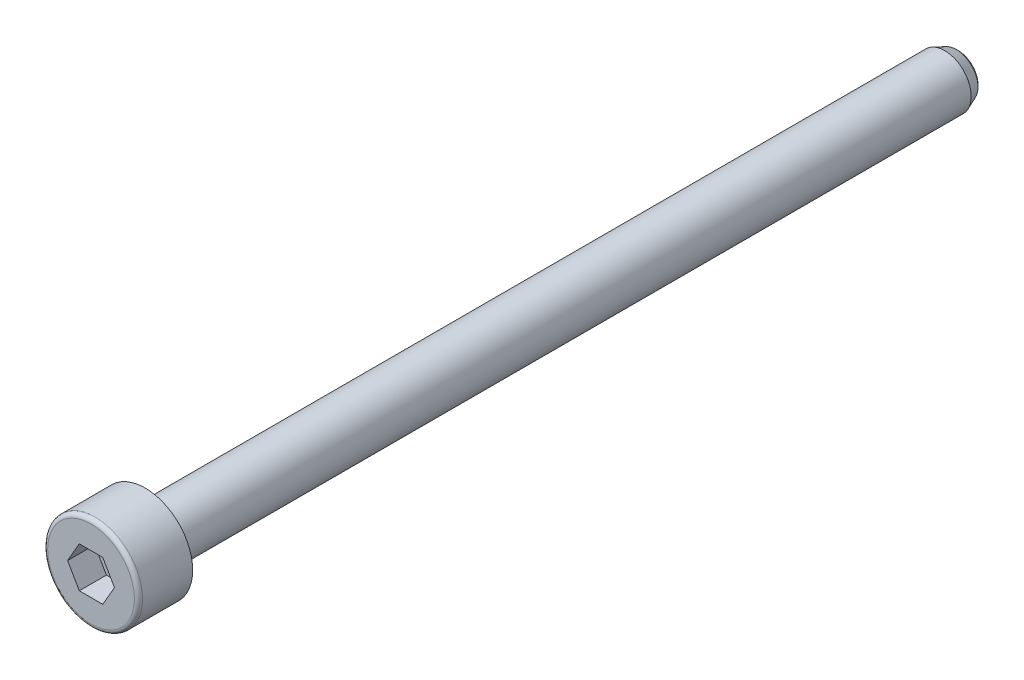
ISO-10303-21;
HEADER;
FILE_DESCRIPTION(('STEP AP214'),'2;1');
FILE_NAME('part.step','',(''),(''),'','','');
FILE_SCHEMA(('AUTOMOTIVE_DESIGN { 1 0 10303 214 1 1 1 1 }'));
ENDSEC;
DATA;
#1=APPLICATION_CONTEXT('core data for automotive mechanical design processes');
#2=APPLICATION_PROTOCOL_DEFINITION('international standard','automotive_design',2000,#1);
#3=PRODUCT_CONTEXT('',#1,'mechanical');
#4=PRODUCT('Part','Part','',(#3));
#5=PRODUCT_RELATED_PRODUCT_CATEGORY('part','',(#4));
#6=PRODUCT_DEFINITION_FORMATION('','',#4);
#7=PRODUCT_DEFINITION_CONTEXT('part definition',#1,'design');
#8=PRODUCT_DEFINITION('design','',#6,#7);
#9=PRODUCT_DEFINITION_SHAPE('','',#8);
#10=(LENGTH_UNIT() NAMED_UNIT(*) SI_UNIT(.MILLI.,.METRE.));
#11=(NAMED_UNIT(*) PLANE_ANGLE_UNIT() SI_UNIT($,.RADIAN.));
#12=(NAMED_UNIT(*) SI_UNIT($,.STERADIAN.) SOLID_ANGLE_UNIT());
#13=UNCERTAINTY_MEASURE_WITH_UNIT(LENGTH_MEASURE(1.E-05),#10,'distance_accuracy_value','');
#14=(GEOMETRIC_REPRESENTATION_CONTEXT(3) GLOBAL_UNCERTAINTY_ASSIGNED_CONTEXT((#13)) GLOBAL_UNIT_ASSIGNED_CONTEXT((#10,
#11,#12)) REPRESENTATION_CONTEXT('',''));
#15=CARTESIAN_POINT('',(0.,0.,0.));
#16=DIRECTION('',(0.,0.,1.));
#17=DIRECTION('',(1.,0.,0.));
#18=AXIS2_PLACEMENT_3D('',#15,#16,#17);
#19=CARTESIAN_POINT('',(1.06858966120171E-13,0.,-60.));
#20=DIRECTION('',(0.,0.,-1.));
#21=DIRECTION('',(0.,-1.,0.));
#22=AXIS2_PLACEMENT_3D('',#19,#20,#21);
#23=PLANE('',#22);
#24=CARTESIAN_POINT('',(1.06776702927888E-13,0.,-60.));
#25=DIRECTION('',(0.,0.,1.));
#26=DIRECTION('',(-1.,0.,0.));
#27=AXIS2_PLACEMENT_3D('',#24,#25,#26);
#28=CIRCLE('',#27,1.454);
#29=CARTESIAN_POINT('',(1.45400000000011,0.,-60.));
#30=VERTEX_POINT('',#29);
#31=EDGE_CURVE('E222',#30,#30,#28,.T.);
#32=ORIENTED_EDGE('',*,*,#31,.F.);
#33=EDGE_LOOP('',(#32));
#34=FACE_BOUND('',#33,.T.);
#35=ADVANCED_FACE('F17',(#34),#23,.T.);
#36=CARTESIAN_POINT('',(1.06581410364015E-13,0.,-5.52775046393468E-13));
#37=DIRECTION('',(0.,0.,1.));
#38=DIRECTION('',(1.,0.,0.));
#39=AXIS2_PLACEMENT_3D('',#36,#37,#38);
#40=PLANE('',#39);
#41=CARTESIAN_POINT('',(1.06776702927888E-13,0.,-5.52682288756586E-13));
#42=DIRECTION('',(0.,0.,-1.));
#43=DIRECTION('',(-1.,0.,0.));
#44=AXIS2_PLACEMENT_3D('',#41,#42,#43);
#45=CIRCLE('',#44,1.954);
#46=CARTESIAN_POINT('',(1.95400000000011,0.,-5.52682288756586E-13));
#47=VERTEX_POINT('',#46);
#48=EDGE_CURVE('E196',#47,#47,#45,.T.);
#49=ORIENTED_EDGE('',*,*,#48,.F.);
#50=EDGE_LOOP('',(#49));
#51=FACE_BOUND('',#50,.T.);
#52=CARTESIAN_POINT('',(1.06776702927888E-13,0.,-5.52775046393468E-13));
#53=DIRECTION('',(0.,0.,1.));
#54=DIRECTION('',(-1.,0.,0.));
#55=AXIS2_PLACEMENT_3D('',#52,#53,#54);
#56=CIRCLE('',#55,3.5);
#57=CARTESIAN_POINT('',(3.50000000000011,0.,-5.52775046393468E-13));
#58=VERTEX_POINT('',#57);
#59=EDGE_CURVE('E125',#58,#58,#56,.T.);
#60=ORIENTED_EDGE('',*,*,#59,.F.);
#61=EDGE_LOOP('',(#60));
#62=FACE_BOUND('',#61,.T.);
#63=ADVANCED_FACE('F284',(#51,#62),#40,.F.);
#64=CARTESIAN_POINT('',(0.,0.,1.99999999999945));
#65=DIRECTION('',(0.,0.,-1.));
#66=DIRECTION('',(0.,-1.,0.));
#67=AXIS2_PLACEMENT_3D('',#64,#65,#66);
#68=PLANE('',#67);
#69=DIRECTION('',(1.,0.,0.));
#70=VECTOR('',#69,1.);
#71=CARTESIAN_POINT('',(0.866025403784441,1.5,1.99999999999945));
#72=LINE('',#71,#70);
#73=CARTESIAN_POINT('',(-0.866025403784439,1.5,1.99999999999945));
#74=VERTEX_POINT('',#73);
#75=CARTESIAN_POINT('',(0.866025403784441,1.5,1.99999999999945));
#76=VERTEX_POINT('',#75);
#77=EDGE_CURVE('E11',#74,#76,#72,.T.);
#78=ORIENTED_EDGE('',*,*,#77,.F.);
#79=DIRECTION('',(0.5,0.866025403784439,0.));
#80=VECTOR('',#79,1.);
#81=CARTESIAN_POINT('',(-0.866025403784439,1.5,1.99999999999945));
#82=LINE('',#81,#80);
#83=CARTESIAN_POINT('',(-1.73205080756888,0.,1.99999999999945));
#84=VERTEX_POINT('',#83);
#85=EDGE_CURVE('E163',#84,#74,#82,.T.);
#86=ORIENTED_EDGE('',*,*,#85,.F.);
#87=DIRECTION('',(-0.5,0.866025403784439,0.));
#88=VECTOR('',#87,1.);
#89=CARTESIAN_POINT('',(-1.73205080756888,0.,1.99999999999945));
#90=LINE('',#89,#88);
#91=CARTESIAN_POINT('',(-0.86602540378444,-1.5,1.99999999999945));
#92=VERTEX_POINT('',#91);
#93=EDGE_CURVE('E171',#92,#84,#90,.T.);
#94=ORIENTED_EDGE('',*,*,#93,.F.);
#95=DIRECTION('',(-1.,0.,0.));
#96=VECTOR('',#95,1.);
#97=CARTESIAN_POINT('',(-0.86602540378444,-1.5,1.99999999999945));
#98=LINE('',#97,#96);
#99=CARTESIAN_POINT('',(0.866025403784436,-1.5,1.99999999999945));
#100=VERTEX_POINT('',#99);
#101=EDGE_CURVE('E176',#100,#92,#98,.T.);
#102=ORIENTED_EDGE('',*,*,#101,.F.);
#103=DIRECTION('',(-0.5,-0.866025403784438,0.));
#104=VECTOR('',#103,1.);
#105=CARTESIAN_POINT('',(0.866025403784436,-1.5,1.99999999999945));
#106=LINE('',#105,#104);
#107=CARTESIAN_POINT('',(1.73205080756888,0.,1.99999999999945));
#108=VERTEX_POINT('',#107);
#109=EDGE_CURVE('E183',#108,#100,#106,.T.);
#110=ORIENTED_EDGE('',*,*,#109,.F.);
#111=DIRECTION('',(0.5,-0.866025403784439,0.));
#112=VECTOR('',#111,1.);
#113=CARTESIAN_POINT('',(1.73205080756888,0.,1.99999999999945));
#114=LINE('',#113,#112);
#115=EDGE_CURVE('E26',#76,#108,#114,.T.);
#116=ORIENTED_EDGE('',*,*,#115,.F.);
#117=EDGE_LOOP('',(#78,#86,#94,#102,#110,#116));
#118=FACE_BOUND('',#117,.T.);
#119=ADVANCED_FACE('F19',(#118),#68,.F.);
#120=CARTESIAN_POINT('',(-0.866025403784439,1.5,3.99999999999945));
#121=DIRECTION('',(0.,1.,0.));
#122=DIRECTION('',(1.,0.,0.));
#123=AXIS2_PLACEMENT_3D('',#120,#121,#122);
#124=PLANE('',#123);
#125=DIRECTION('',(1.,0.,0.));
#126=VECTOR('',#125,1.);
#127=CARTESIAN_POINT('',(-0.433012701892165,1.5,3.99999999999945));
#128=LINE('',#127,#126);
#129=CARTESIAN_POINT('',(-0.866025403784439,1.5,3.99999999999945));
#130=VERTEX_POINT('',#129);
#131=CARTESIAN_POINT('',(0.866025403784441,1.5,3.99999999999945));
#132=VERTEX_POINT('',#131);
#133=EDGE_CURVE('E144',#130,#132,#128,.T.);
#134=ORIENTED_EDGE('',*,*,#133,.F.);
#135=DIRECTION('',(0.,0.,-1.));
#136=VECTOR('',#135,1.);
#137=CARTESIAN_POINT('',(-0.866025403784439,1.5,3.99999999999945));
#138=LINE('',#137,#136);
#139=EDGE_CURVE('E164',#130,#74,#138,.T.);
#140=ORIENTED_EDGE('',*,*,#139,.T.);
#141=ORIENTED_EDGE('',*,*,#77,.T.);
#142=DIRECTION('',(0.,0.,-1.));
#143=VECTOR('',#142,1.);
#144=CARTESIAN_POINT('',(0.866025403784441,1.5,3.99999999999945));
#145=LINE('',#144,#143);
#146=EDGE_CURVE('E185',#132,#76,#145,.T.);
#147=ORIENTED_EDGE('',*,*,#146,.F.);
#148=EDGE_LOOP('',(#134,#140,#141,#147));
#149=FACE_BOUND('',#148,.T.);
#150=ADVANCED_FACE('F239',(#149),#124,.F.);
#151=CARTESIAN_POINT('',(0.866025403784441,1.5,3.99999999999945));
#152=DIRECTION('',(0.866025403784439,0.5,0.));
#153=DIRECTION('',(0.,0.,-1.));
#154=AXIS2_PLACEMENT_3D('',#151,#152,#153);
#155=PLANE('',#154);
#156=DIRECTION('',(0.5,-0.866025403784439,0.));
#157=VECTOR('',#156,1.);
#158=CARTESIAN_POINT('',(1.08253175473056,1.12499999999998,3.99999999999945));
#159=LINE('',#158,#157);
#160=CARTESIAN_POINT('',(1.73205080756888,0.,3.99999999999945));
#161=VERTEX_POINT('',#160);
#162=EDGE_CURVE('E146',#132,#161,#159,.T.);
#163=ORIENTED_EDGE('',*,*,#162,.F.);
#164=ORIENTED_EDGE('',*,*,#146,.T.);
#165=ORIENTED_EDGE('',*,*,#115,.T.);
#166=DIRECTION('',(0.,0.,-1.));
#167=VECTOR('',#166,1.);
#168=CARTESIAN_POINT('',(1.73205080756888,0.,3.99999999999945));
#169=LINE('',#168,#167);
#170=EDGE_CURVE('E179',#161,#108,#169,.T.);
#171=ORIENTED_EDGE('',*,*,#170,.F.);
#172=EDGE_LOOP('',(#163,#164,#165,#171));
#173=FACE_BOUND('',#172,.T.);
#174=ADVANCED_FACE('F307',(#173),#155,.F.);
#175=CARTESIAN_POINT('',(1.73205080756888,0.,3.99999999999945));
#176=DIRECTION('',(0.866025403784438,-0.5,0.));
#177=DIRECTION('',(0.,0.,-1.));
#178=AXIS2_PLACEMENT_3D('',#175,#176,#177);
#179=PLANE('',#178);
#180=DIRECTION('',(-0.5,-0.866025403784438,0.));
#181=VECTOR('',#180,1.);
#182=CARTESIAN_POINT('',(1.51554445662278,-0.374999999999979,3.99999999999945));
#183=LINE('',#182,#181);
#184=CARTESIAN_POINT('',(0.866025403784436,-1.5,3.99999999999945));
#185=VERTEX_POINT('',#184);
#186=EDGE_CURVE('E150',#161,#185,#183,.T.);
#187=ORIENTED_EDGE('',*,*,#186,.F.);
#188=ORIENTED_EDGE('',*,*,#170,.T.);
#189=ORIENTED_EDGE('',*,*,#109,.T.);
#190=DIRECTION('',(0.,0.,-1.));
#191=VECTOR('',#190,1.);
#192=CARTESIAN_POINT('',(0.866025403784436,-1.5,3.99999999999945));
#193=LINE('',#192,#191);
#194=EDGE_CURVE('E172',#185,#100,#193,.T.);
#195=ORIENTED_EDGE('',*,*,#194,.F.);
#196=EDGE_LOOP('',(#187,#188,#189,#195));
#197=FACE_BOUND('',#196,.T.);
#198=ADVANCED_FACE('F298',(#197),#179,.F.);
#199=CARTESIAN_POINT('',(0.866025403784436,-1.5,3.99999999999945));
#200=DIRECTION('',(0.,-1.,0.));
#201=DIRECTION('',(-1.,0.,0.));
#202=AXIS2_PLACEMENT_3D('',#199,#200,#201);
#203=PLANE('',#202);
#204=DIRECTION('',(-1.,0.,0.));
#205=VECTOR('',#204,1.);
#206=CARTESIAN_POINT('',(0.433012701892271,-1.5,3.99999999999945));
#207=LINE('',#206,#205);
#208=CARTESIAN_POINT('',(-0.86602540378444,-1.5,3.99999999999945));
#209=VERTEX_POINT('',#208);
#210=EDGE_CURVE('E154',#185,#209,#207,.T.);
#211=ORIENTED_EDGE('',*,*,#210,.F.);
#212=ORIENTED_EDGE('',*,*,#194,.T.);
#213=ORIENTED_EDGE('',*,*,#101,.T.);
#214=DIRECTION('',(0.,0.,-1.));
#215=VECTOR('',#214,1.);
#216=CARTESIAN_POINT('',(-0.86602540378444,-1.5,3.99999999999945));
#217=LINE('',#216,#215);
#218=EDGE_CURVE('E167',#209,#92,#217,.T.);
#219=ORIENTED_EDGE('',*,*,#218,.F.);
#220=EDGE_LOOP('',(#211,#212,#213,#219));
#221=FACE_BOUND('',#220,.T.);
#222=ADVANCED_FACE('F295',(#221),#203,.F.);
#223=CARTESIAN_POINT('',(-0.86602540378444,-1.5,3.99999999999945));
#224=DIRECTION('',(-0.866025403784439,-0.5,0.));
#225=DIRECTION('',(-0.5,0.866025403784439,0.));
#226=AXIS2_PLACEMENT_3D('',#223,#224,#225);
#227=PLANE('',#226);
#228=DIRECTION('',(-0.5,0.866025403784439,0.));
#229=VECTOR('',#228,1.);
#230=CARTESIAN_POINT('',(-1.08253175473054,-1.12500000000002,3.99999999999945));
#231=LINE('',#230,#229);
#232=CARTESIAN_POINT('',(-1.73205080756888,0.,3.99999999999945));
#233=VERTEX_POINT('',#232);
#234=EDGE_CURVE('E158',#209,#233,#231,.T.);
#235=ORIENTED_EDGE('',*,*,#234,.F.);
#236=ORIENTED_EDGE('',*,*,#218,.T.);
#237=ORIENTED_EDGE('',*,*,#93,.T.);
#238=DIRECTION('',(0.,0.,-1.));
#239=VECTOR('',#238,1.);
#240=CARTESIAN_POINT('',(-1.73205080756888,0.,3.99999999999945));
#241=LINE('',#240,#239);
#242=EDGE_CURVE('E159',#233,#84,#241,.T.);
#243=ORIENTED_EDGE('',*,*,#242,.F.);
#244=EDGE_LOOP('',(#235,#236,#237,#243));
#245=FACE_BOUND('',#244,.T.);
#246=ADVANCED_FACE('F297',(#245),#227,.F.);
#247=CARTESIAN_POINT('',(-1.73205080756888,0.,3.99999999999945));
#248=DIRECTION('',(-0.866025403784439,0.5,0.));
#249=DIRECTION('',(0.,0.,1.));
#250=AXIS2_PLACEMENT_3D('',#247,#248,#249);
#251=PLANE('',#250);
#252=DIRECTION('',(0.5,0.866025403784439,0.));
#253=VECTOR('',#252,1.);
#254=CARTESIAN_POINT('',(-1.51554445662276,0.375000000000023,3.99999999999945));
#255=LINE('',#254,#253);
#256=EDGE_CURVE('E203',#233,#130,#255,.T.);
#257=ORIENTED_EDGE('',*,*,#256,.F.);
#258=ORIENTED_EDGE('',*,*,#242,.T.);
#259=ORIENTED_EDGE('',*,*,#85,.T.);
#260=ORIENTED_EDGE('',*,*,#139,.F.);
#261=EDGE_LOOP('',(#257,#258,#259,#260));
#262=FACE_BOUND('',#261,.T.);
#263=ADVANCED_FACE('F234',(#262),#251,.F.);
#264=CARTESIAN_POINT('',(1.06581410364015E-13,0.,3.99999999999945));
#265=DIRECTION('',(0.,0.,1.));
#266=DIRECTION('',(1.,0.,0.));
#267=AXIS2_PLACEMENT_3D('',#264,#265,#266);
#268=PLANE('',#267);
#269=ORIENTED_EDGE('',*,*,#256,.T.);
#270=ORIENTED_EDGE('',*,*,#133,.T.);
#271=ORIENTED_EDGE('',*,*,#162,.T.);
#272=ORIENTED_EDGE('',*,*,#186,.T.);
#273=ORIENTED_EDGE('',*,*,#210,.T.);
#274=ORIENTED_EDGE('',*,*,#234,.T.);
#275=EDGE_LOOP('',(#269,#270,#271,#272,#273,#274));
#276=FACE_BOUND('',#275,.T.);
#277=CARTESIAN_POINT('',(1.06776702927888E-13,0.,3.99999999999945));
#278=DIRECTION('',(0.,0.,-1.));
#279=DIRECTION('',(-1.,0.,0.));
#280=AXIS2_PLACEMENT_3D('',#277,#278,#279);
#281=CIRCLE('',#280,3.2);
#282=CARTESIAN_POINT('',(-3.19999999999989,0.,3.99999999999945));
#283=VERTEX_POINT('',#282);
#284=EDGE_CURVE('E141',#283,#283,#281,.T.);
#285=ORIENTED_EDGE('',*,*,#284,.F.);
#286=EDGE_LOOP('',(#285));
#287=FACE_BOUND('',#286,.T.);
#288=ADVANCED_FACE('F244',(#276,#287),#268,.T.);
#289=CARTESIAN_POINT('',(1.06776702927888E-13,0.,-5.52775046393468E-13));
#290=DIRECTION('',(0.,0.,1.));
#291=DIRECTION('',(-1.,0.,0.));
#292=AXIS2_PLACEMENT_3D('',#289,#290,#291);
#293=CYLINDRICAL_SURFACE('',#292,3.5);
#294=CARTESIAN_POINT('',(1.06776702927888E-13,0.,3.69999999999945));
#295=DIRECTION('',(0.,0.,1.));
#296=DIRECTION('',(-1.,0.,0.));
#297=AXIS2_PLACEMENT_3D('',#294,#295,#296);
#298=CIRCLE('',#297,3.5);
#299=CARTESIAN_POINT('',(3.50000000000011,0.,3.69999999999945));
#300=VERTEX_POINT('',#299);
#301=CARTESIAN_POINT('',(-3.49999999999989,0.,3.69999999999945));
#302=VERTEX_POINT('',#301);
#303=EDGE_CURVE('E127',#300,#302,#298,.T.);
#304=ORIENTED_EDGE('',*,*,#303,.F.);
#305=DIRECTION('',(0.,0.,-1.));
#306=VECTOR('',#305,1.);
#307=CARTESIAN_POINT('',(3.50000000000011,0.,-5.52775046393468E-13));
#308=LINE('',#307,#306);
#309=EDGE_CURVE('E118',#300,#58,#308,.T.);
#310=ORIENTED_EDGE('',*,*,#309,.T.);
#311=ORIENTED_EDGE('',*,*,#59,.T.);
#312=ORIENTED_EDGE('',*,*,#309,.F.);
#313=CARTESIAN_POINT('',(1.06776702927888E-13,0.,3.69999999999945));
#314=DIRECTION('',(0.,0.,1.));
#315=DIRECTION('',(-1.,0.,0.));
#316=AXIS2_PLACEMENT_3D('',#313,#314,#315);
#317=CIRCLE('',#316,3.5);
#318=EDGE_CURVE('E122',#302,#300,#317,.T.);
#319=ORIENTED_EDGE('',*,*,#318,.F.);
#320=EDGE_LOOP('',(#304,#310,#311,#312,#319));
#321=FACE_BOUND('',#320,.T.);
#322=ADVANCED_FACE('F120',(#321),#293,.T.);
#323=CARTESIAN_POINT('',(1.06776702927888E-13,0.,3.69999999999945));
#324=DIRECTION('',(0.,0.,1.));
#325=DIRECTION('',(1.,0.,0.));
#326=AXIS2_PLACEMENT_3D('',#323,#324,#325);
#327=TOROIDAL_SURFACE('',#326,3.2,0.3);
#328=ORIENTED_EDGE('',*,*,#284,.T.);
#329=CARTESIAN_POINT('',(-3.19999999999989,0.,3.69999999999945));
#330=DIRECTION('',(0.,-1.,0.));
#331=DIRECTION('',(-1.,0.,0.));
#332=AXIS2_PLACEMENT_3D('',#329,#330,#331);
#333=CIRCLE('',#332,0.3);
#334=EDGE_CURVE('E134',#283,#302,#333,.T.);
#335=ORIENTED_EDGE('',*,*,#334,.T.);
#336=ORIENTED_EDGE('',*,*,#318,.T.);
#337=ORIENTED_EDGE('',*,*,#303,.T.);
#338=ORIENTED_EDGE('',*,*,#334,.F.);
#339=EDGE_LOOP('',(#328,#335,#336,#337,#338));
#340=FACE_BOUND('',#339,.T.);
#341=ADVANCED_FACE('F133',(#340),#327,.T.);
#342=CARTESIAN_POINT('',(1.06776702927888E-13,0.,-5.52682288756586E-13));
#343=DIRECTION('',(0.,0.,-1.));
#344=DIRECTION('',(-1.,0.,0.));
#345=AXIS2_PLACEMENT_3D('',#342,#343,#344);
#346=CYLINDRICAL_SURFACE('',#345,1.954);
#347=CARTESIAN_POINT('',(1.06776702927888E-13,0.,-59.));
#348=DIRECTION('',(0.,0.,-1.));
#349=DIRECTION('',(-1.,0.,0.));
#350=AXIS2_PLACEMENT_3D('',#347,#348,#349);
#351=CIRCLE('',#350,1.954);
#352=CARTESIAN_POINT('',(1.95400000000011,0.,-59.));
#353=VERTEX_POINT('',#352);
#354=EDGE_CURVE('E257',#353,#353,#351,.T.);
#355=ORIENTED_EDGE('',*,*,#354,.F.);
#356=DIRECTION('',(0.,0.,1.));
#357=VECTOR('',#356,1.);
#358=CARTESIAN_POINT('',(1.95400000000011,0.,-5.52682288756586E-13));
#359=LINE('',#358,#357);
#360=EDGE_CURVE('E209',#353,#47,#359,.T.);
#361=ORIENTED_EDGE('',*,*,#360,.T.);
#362=ORIENTED_EDGE('',*,*,#48,.T.);
#363=ORIENTED_EDGE('',*,*,#360,.F.);
#364=EDGE_LOOP('',(#355,#361,#362,#363));
#365=FACE_BOUND('',#364,.T.);
#366=ADVANCED_FACE('F269',(#365),#346,.T.);
#367=CARTESIAN_POINT('',(1.06776702927888E-13,0.,-59.75));
#368=DIRECTION('',(0.,0.,1.));
#369=DIRECTION('',(-1.,0.,0.));
#370=AXIS2_PLACEMENT_3D('',#367,#368,#369);
#371=CONICAL_SURFACE('',#370,1.704,0.78539816339745);
#372=ORIENTED_EDGE('',*,*,#31,.T.);
#373=DIRECTION('',(0.707106781186549,0.,0.707106781186546));
#374=VECTOR('',#373,1.);
#375=CARTESIAN_POINT('',(1.70400000000011,0.,-59.75));
#376=LINE('',#375,#374);
#377=CARTESIAN_POINT('',(1.60044660940683,0.,-59.8535533905938));
#378=VERTEX_POINT('',#377);
#379=EDGE_CURVE('E216',#30,#378,#376,.T.);
#380=ORIENTED_EDGE('',*,*,#379,.T.);
#381=CARTESIAN_POINT('',(1.06858966120171E-13,0.,-59.8535533905938));
#382=DIRECTION('',(0.,0.,1.));
#383=DIRECTION('',(-1.,0.,0.));
#384=AXIS2_PLACEMENT_3D('',#381,#382,#383);
#385=CIRCLE('',#384,1.60044660940672);
#386=EDGE_CURVE('E253',#378,#378,#385,.T.);
#387=ORIENTED_EDGE('',*,*,#386,.F.);
#388=ORIENTED_EDGE('',*,*,#379,.F.);
#389=EDGE_LOOP('',(#372,#380,#387,#388));
#390=FACE_BOUND('',#389,.T.);
#391=ADVANCED_FACE('F271',(#390),#371,.T.);
#392=CARTESIAN_POINT('',(1.06817834524029E-13,0.,-59.4267766952972));
#393=DIRECTION('',(0.,0.,1.));
#394=DIRECTION('',(-1.,0.,0.));
#395=AXIS2_PLACEMENT_3D('',#392,#393,#394);
#396=CONICAL_SURFACE('',#395,1.77722330470336,0.392699081698729);
#397=ORIENTED_EDGE('',*,*,#386,.T.);
#398=DIRECTION('',(0.382683432365095,0.,0.923879532511285));
#399=VECTOR('',#398,1.);
#400=CARTESIAN_POINT('',(1.77722330470347,0.,-59.4267766952972));
#401=LINE('',#400,#399);
#402=EDGE_CURVE('E258',#378,#353,#401,.T.);
#403=ORIENTED_EDGE('',*,*,#402,.T.);
#404=ORIENTED_EDGE('',*,*,#354,.T.);
#405=ORIENTED_EDGE('',*,*,#402,.F.);
#406=EDGE_LOOP('',(#397,#403,#404,#405));
#407=FACE_BOUND('',#406,.T.);
#408=ADVANCED_FACE('F268',(#407),#396,.T.);
#409=CLOSED_SHELL('',(#35,#63,#119,#150,#174,#198,#222,#246,#263,#288,#322,#341,#366,#391,#408));
#410=MANIFOLD_SOLID_BREP('B1',#409);
#411=ADVANCED_BREP_SHAPE_REPRESENTATION('',(#18,#410),#14);
#412=SHAPE_DEFINITION_REPRESENTATION(#9,#411);
ENDSEC;
END-ISO-10303-21;
